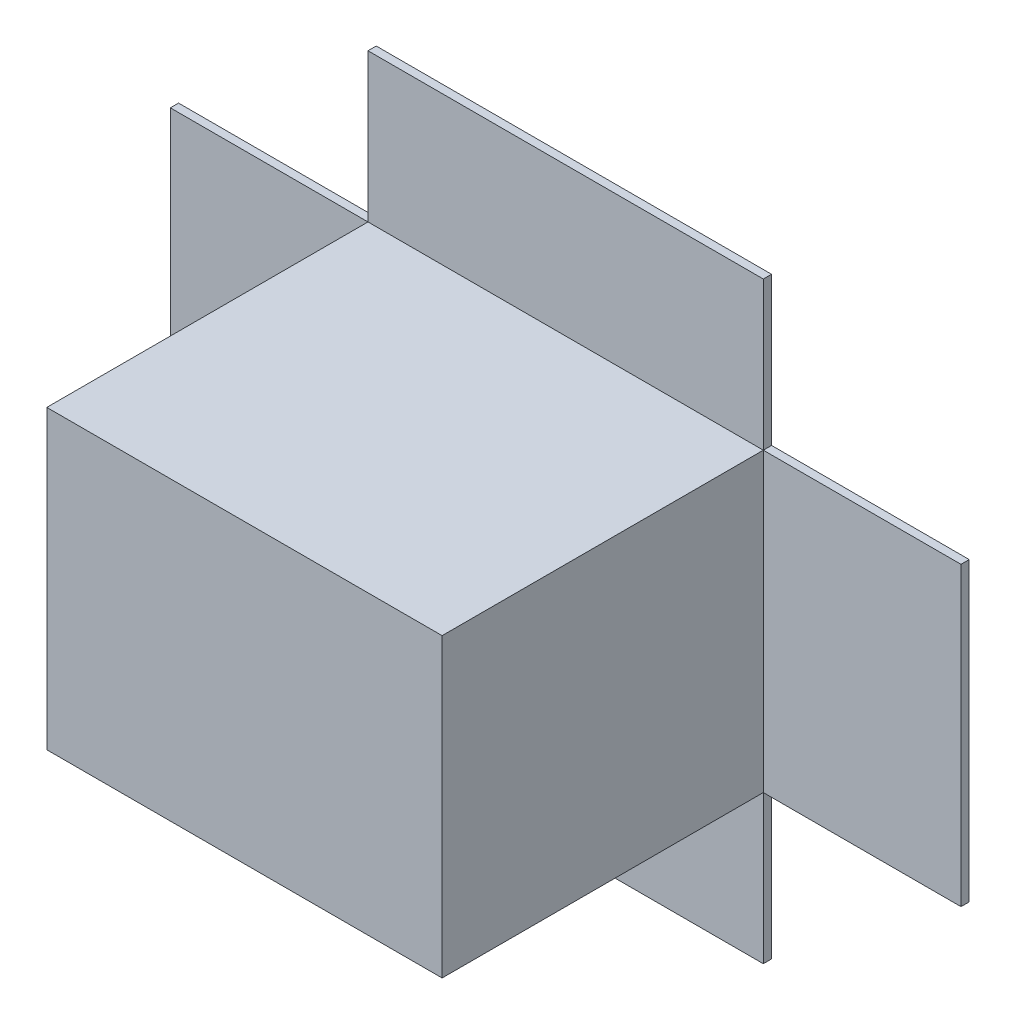
ISO-10303-21;
HEADER;
FILE_DESCRIPTION(('STEP AP214'),'2;1');
FILE_NAME('part.step','',(''),(''),'','','');
FILE_SCHEMA(('AUTOMOTIVE_DESIGN { 1 0 10303 214 1 1 1 1 }'));
ENDSEC;
DATA;
#1=APPLICATION_CONTEXT('core data for automotive mechanical design processes');
#2=APPLICATION_PROTOCOL_DEFINITION('international standard','automotive_design',2000,#1);
#3=PRODUCT_CONTEXT('',#1,'mechanical');
#4=PRODUCT('Part','Part','',(#3));
#5=PRODUCT_RELATED_PRODUCT_CATEGORY('part','',(#4));
#6=PRODUCT_DEFINITION_FORMATION('','',#4);
#7=PRODUCT_DEFINITION_CONTEXT('part definition',#1,'design');
#8=PRODUCT_DEFINITION('design','',#6,#7);
#9=PRODUCT_DEFINITION_SHAPE('','',#8);
#10=(LENGTH_UNIT() NAMED_UNIT(*) SI_UNIT(.MILLI.,.METRE.));
#11=(NAMED_UNIT(*) PLANE_ANGLE_UNIT() SI_UNIT($,.RADIAN.));
#12=(NAMED_UNIT(*) SI_UNIT($,.STERADIAN.) SOLID_ANGLE_UNIT());
#13=UNCERTAINTY_MEASURE_WITH_UNIT(LENGTH_MEASURE(1.E-05),#10,'distance_accuracy_value','');
#14=(GEOMETRIC_REPRESENTATION_CONTEXT(3) GLOBAL_UNCERTAINTY_ASSIGNED_CONTEXT((#13)) GLOBAL_UNIT_ASSIGNED_CONTEXT((#10,
#11,#12)) REPRESENTATION_CONTEXT('',''));
#15=CARTESIAN_POINT('',(0.,0.,0.));
#16=DIRECTION('',(0.,0.,1.));
#17=DIRECTION('',(1.,0.,0.));
#18=AXIS2_PLACEMENT_3D('',#15,#16,#17);
#19=CARTESIAN_POINT('',(0.,0.,0.));
#20=DIRECTION('',(0.,0.,-1.));
#21=DIRECTION('',(0.,-1.,0.));
#22=AXIS2_PLACEMENT_3D('',#19,#20,#21);
#23=PLANE('',#22);
#24=DIRECTION('',(-1.,0.,0.));
#25=VECTOR('',#24,1.);
#26=CARTESIAN_POINT('',(57.5,-44.5,0.));
#27=LINE('',#26,#25);
#28=CARTESIAN_POINT('',(-59.5,-44.5,0.));
#29=VERTEX_POINT('',#28);
#30=CARTESIAN_POINT('',(59.5,-44.5,0.));
#31=VERTEX_POINT('',#30);
#32=EDGE_CURVE('E403',#29,#31,#27,.F.);
#33=ORIENTED_EDGE('',*,*,#32,.T.);
#34=DIRECTION('',(0.,-1.,0.));
#35=VECTOR('',#34,1.);
#36=CARTESIAN_POINT('',(59.5,42.5,0.));
#37=LINE('',#36,#35);
#38=CARTESIAN_POINT('',(59.5,44.5,0.));
#39=VERTEX_POINT('',#38);
#40=EDGE_CURVE('E406',#31,#39,#37,.F.);
#41=ORIENTED_EDGE('',*,*,#40,.T.);
#42=DIRECTION('',(1.,0.,0.));
#43=VECTOR('',#42,1.);
#44=CARTESIAN_POINT('',(-57.5,44.5,0.));
#45=LINE('',#44,#43);
#46=CARTESIAN_POINT('',(-59.5,44.5,0.));
#47=VERTEX_POINT('',#46);
#48=EDGE_CURVE('E400',#39,#47,#45,.F.);
#49=ORIENTED_EDGE('',*,*,#48,.T.);
#50=DIRECTION('',(0.,1.,0.));
#51=VECTOR('',#50,1.);
#52=CARTESIAN_POINT('',(-59.5,-42.5,0.));
#53=LINE('',#52,#51);
#54=EDGE_CURVE('E397',#47,#29,#53,.F.);
#55=ORIENTED_EDGE('',*,*,#54,.T.);
#56=EDGE_LOOP('',(#33,#41,#49,#55));
#57=FACE_BOUND('',#56,.T.);
#58=DIRECTION('',(0.,1.,0.));
#59=VECTOR('',#58,1.);
#60=CARTESIAN_POINT('',(60.,45.,0.));
#61=LINE('',#60,#59);
#62=CARTESIAN_POINT('',(60.,45.,0.));
#63=VERTEX_POINT('',#62);
#64=CARTESIAN_POINT('',(60.,90.,0.));
#65=VERTEX_POINT('',#64);
#66=EDGE_CURVE('E297',#63,#65,#61,.T.);
#67=ORIENTED_EDGE('',*,*,#66,.F.);
#68=DIRECTION('',(1.,0.,0.));
#69=VECTOR('',#68,1.);
#70=CARTESIAN_POINT('',(60.,45.,0.));
#71=LINE('',#70,#69);
#72=CARTESIAN_POINT('',(120.,45.,0.));
#73=VERTEX_POINT('',#72);
#74=EDGE_CURVE('E362',#63,#73,#71,.T.);
#75=ORIENTED_EDGE('',*,*,#74,.T.);
#76=DIRECTION('',(0.,1.,0.));
#77=VECTOR('',#76,1.);
#78=CARTESIAN_POINT('',(120.,-45.,0.));
#79=LINE('',#78,#77);
#80=CARTESIAN_POINT('',(120.,-45.,0.));
#81=VERTEX_POINT('',#80);
#82=EDGE_CURVE('E268',#81,#73,#79,.T.);
#83=ORIENTED_EDGE('',*,*,#82,.F.);
#84=DIRECTION('',(1.,0.,0.));
#85=VECTOR('',#84,1.);
#86=CARTESIAN_POINT('',(60.,-45.,0.));
#87=LINE('',#86,#85);
#88=CARTESIAN_POINT('',(60.,-45.,0.));
#89=VERTEX_POINT('',#88);
#90=EDGE_CURVE('E274',#89,#81,#87,.T.);
#91=ORIENTED_EDGE('',*,*,#90,.F.);
#92=DIRECTION('',(0.,-1.,0.));
#93=VECTOR('',#92,1.);
#94=CARTESIAN_POINT('',(60.,-45.,0.));
#95=LINE('',#94,#93);
#96=CARTESIAN_POINT('',(60.,-90.,0.));
#97=VERTEX_POINT('',#96);
#98=EDGE_CURVE('E358',#89,#97,#95,.T.);
#99=ORIENTED_EDGE('',*,*,#98,.T.);
#100=DIRECTION('',(-1.,0.,0.));
#101=VECTOR('',#100,1.);
#102=CARTESIAN_POINT('',(60.,-90.,0.));
#103=LINE('',#102,#101);
#104=CARTESIAN_POINT('',(-60.,-90.,0.));
#105=VERTEX_POINT('',#104);
#106=EDGE_CURVE('E363',#97,#105,#103,.T.);
#107=ORIENTED_EDGE('',*,*,#106,.T.);
#108=DIRECTION('',(0.,-1.,0.));
#109=VECTOR('',#108,1.);
#110=CARTESIAN_POINT('',(-60.,-45.,0.));
#111=LINE('',#110,#109);
#112=CARTESIAN_POINT('',(-60.,-45.,0.));
#113=VERTEX_POINT('',#112);
#114=EDGE_CURVE('E273',#113,#105,#111,.T.);
#115=ORIENTED_EDGE('',*,*,#114,.F.);
#116=DIRECTION('',(-1.,0.,0.));
#117=VECTOR('',#116,1.);
#118=CARTESIAN_POINT('',(-60.,-45.,0.));
#119=LINE('',#118,#117);
#120=CARTESIAN_POINT('',(-120.,-45.,0.));
#121=VERTEX_POINT('',#120);
#122=EDGE_CURVE('E320',#113,#121,#119,.T.);
#123=ORIENTED_EDGE('',*,*,#122,.T.);
#124=DIRECTION('',(0.,-1.,0.));
#125=VECTOR('',#124,1.);
#126=CARTESIAN_POINT('',(-120.,45.,0.));
#127=LINE('',#126,#125);
#128=CARTESIAN_POINT('',(-120.,45.,0.));
#129=VERTEX_POINT('',#128);
#130=EDGE_CURVE('E302',#129,#121,#127,.T.);
#131=ORIENTED_EDGE('',*,*,#130,.F.);
#132=DIRECTION('',(-1.,0.,0.));
#133=VECTOR('',#132,1.);
#134=CARTESIAN_POINT('',(-60.,45.,0.));
#135=LINE('',#134,#133);
#136=CARTESIAN_POINT('',(-60.,45.,0.));
#137=VERTEX_POINT('',#136);
#138=EDGE_CURVE('E284',#137,#129,#135,.T.);
#139=ORIENTED_EDGE('',*,*,#138,.F.);
#140=DIRECTION('',(0.,1.,0.));
#141=VECTOR('',#140,1.);
#142=CARTESIAN_POINT('',(-60.,45.,0.));
#143=LINE('',#142,#141);
#144=CARTESIAN_POINT('',(-60.,90.,0.));
#145=VERTEX_POINT('',#144);
#146=EDGE_CURVE('E316',#137,#145,#143,.T.);
#147=ORIENTED_EDGE('',*,*,#146,.T.);
#148=DIRECTION('',(-1.,0.,0.));
#149=VECTOR('',#148,1.);
#150=CARTESIAN_POINT('',(60.,90.,0.));
#151=LINE('',#150,#149);
#152=EDGE_CURVE('E298',#65,#145,#151,.T.);
#153=ORIENTED_EDGE('',*,*,#152,.F.);
#154=EDGE_LOOP('',(#67,#75,#83,#91,#99,#107,#115,#123,#131,#139,#147,#153));
#155=FACE_BOUND('',#154,.T.);
#156=ADVANCED_FACE('F47',(#57,#155),#23,.T.);
#157=CARTESIAN_POINT('',(-57.5,42.5,97.5));
#158=DIRECTION('',(0.,1.,0.));
#159=DIRECTION('',(1.,0.,0.));
#160=AXIS2_PLACEMENT_3D('',#157,#158,#159);
#161=PLANE('',#160);
#162=DIRECTION('',(0.,0.,-1.));
#163=VECTOR('',#162,1.);
#164=CARTESIAN_POINT('',(-57.5,42.5,97.5));
#165=LINE('',#164,#163);
#166=CARTESIAN_POINT('',(-57.5,42.5,97.5));
#167=VERTEX_POINT('',#166);
#168=CARTESIAN_POINT('',(-57.5,42.5,2.));
#169=VERTEX_POINT('',#168);
#170=EDGE_CURVE('E321',#167,#169,#165,.T.);
#171=ORIENTED_EDGE('',*,*,#170,.T.);
#172=DIRECTION('',(1.,0.,0.));
#173=VECTOR('',#172,1.);
#174=CARTESIAN_POINT('',(57.5,42.5,2.));
#175=LINE('',#174,#173);
#176=CARTESIAN_POINT('',(57.5,42.5,2.));
#177=VERTEX_POINT('',#176);
#178=EDGE_CURVE('E57',#169,#177,#175,.T.);
#179=ORIENTED_EDGE('',*,*,#178,.T.);
#180=DIRECTION('',(0.,0.,-1.));
#181=VECTOR('',#180,1.);
#182=CARTESIAN_POINT('',(57.5,42.5,97.5));
#183=LINE('',#182,#181);
#184=CARTESIAN_POINT('',(57.5,42.5,97.5));
#185=VERTEX_POINT('',#184);
#186=EDGE_CURVE('E231',#185,#177,#183,.T.);
#187=ORIENTED_EDGE('',*,*,#186,.F.);
#188=DIRECTION('',(1.,0.,0.));
#189=VECTOR('',#188,1.);
#190=CARTESIAN_POINT('',(-57.5,42.5,97.5));
#191=LINE('',#190,#189);
#192=EDGE_CURVE('E222',#167,#185,#191,.T.);
#193=ORIENTED_EDGE('',*,*,#192,.F.);
#194=EDGE_LOOP('',(#171,#179,#187,#193));
#195=FACE_BOUND('',#194,.T.);
#196=ADVANCED_FACE('F234',(#195),#161,.F.);
#197=CARTESIAN_POINT('',(-57.5,-42.5,97.5));
#198=DIRECTION('',(-1.,0.,0.));
#199=DIRECTION('',(0.,0.,1.));
#200=AXIS2_PLACEMENT_3D('',#197,#198,#199);
#201=PLANE('',#200);
#202=DIRECTION('',(0.,0.,-1.));
#203=VECTOR('',#202,1.);
#204=CARTESIAN_POINT('',(-57.5,-42.5,97.5));
#205=LINE('',#204,#203);
#206=CARTESIAN_POINT('',(-57.5,-42.5,97.5));
#207=VERTEX_POINT('',#206);
#208=CARTESIAN_POINT('',(-57.5,-42.5,2.));
#209=VERTEX_POINT('',#208);
#210=EDGE_CURVE('E381',#207,#209,#205,.T.);
#211=ORIENTED_EDGE('',*,*,#210,.T.);
#212=DIRECTION('',(0.,1.,0.));
#213=VECTOR('',#212,1.);
#214=CARTESIAN_POINT('',(-57.5,42.5,2.));
#215=LINE('',#214,#213);
#216=EDGE_CURVE('E11',#209,#169,#215,.T.);
#217=ORIENTED_EDGE('',*,*,#216,.T.);
#218=ORIENTED_EDGE('',*,*,#170,.F.);
#219=DIRECTION('',(0.,1.,0.));
#220=VECTOR('',#219,1.);
#221=CARTESIAN_POINT('',(-57.5,-42.5,97.5));
#222=LINE('',#221,#220);
#223=EDGE_CURVE('E228',#207,#167,#222,.T.);
#224=ORIENTED_EDGE('',*,*,#223,.F.);
#225=EDGE_LOOP('',(#211,#217,#218,#224));
#226=FACE_BOUND('',#225,.T.);
#227=ADVANCED_FACE('F581',(#226),#201,.F.);
#228=CARTESIAN_POINT('',(57.5,-42.5,97.5));
#229=DIRECTION('',(0.,-1.,0.));
#230=DIRECTION('',(0.,0.,-1.));
#231=AXIS2_PLACEMENT_3D('',#228,#229,#230);
#232=PLANE('',#231);
#233=DIRECTION('',(0.,0.,-1.));
#234=VECTOR('',#233,1.);
#235=CARTESIAN_POINT('',(57.5,-42.5,97.5));
#236=LINE('',#235,#234);
#237=CARTESIAN_POINT('',(57.5,-42.5,97.5));
#238=VERTEX_POINT('',#237);
#239=CARTESIAN_POINT('',(57.5,-42.5,2.));
#240=VERTEX_POINT('',#239);
#241=EDGE_CURVE('E240',#238,#240,#236,.T.);
#242=ORIENTED_EDGE('',*,*,#241,.T.);
#243=DIRECTION('',(-1.,0.,0.));
#244=VECTOR('',#243,1.);
#245=CARTESIAN_POINT('',(-57.5,-42.5,2.));
#246=LINE('',#245,#244);
#247=EDGE_CURVE('E71',#240,#209,#246,.T.);
#248=ORIENTED_EDGE('',*,*,#247,.T.);
#249=ORIENTED_EDGE('',*,*,#210,.F.);
#250=DIRECTION('',(-1.,0.,0.));
#251=VECTOR('',#250,1.);
#252=CARTESIAN_POINT('',(57.5,-42.5,97.5));
#253=LINE('',#252,#251);
#254=EDGE_CURVE('E245',#238,#207,#253,.T.);
#255=ORIENTED_EDGE('',*,*,#254,.F.);
#256=EDGE_LOOP('',(#242,#248,#249,#255));
#257=FACE_BOUND('',#256,.T.);
#258=ADVANCED_FACE('F441',(#257),#232,.F.);
#259=CARTESIAN_POINT('',(57.5,42.5,97.5));
#260=DIRECTION('',(1.,0.,0.));
#261=DIRECTION('',(0.,1.,0.));
#262=AXIS2_PLACEMENT_3D('',#259,#260,#261);
#263=PLANE('',#262);
#264=ORIENTED_EDGE('',*,*,#186,.T.);
#265=DIRECTION('',(0.,-1.,0.));
#266=VECTOR('',#265,1.);
#267=CARTESIAN_POINT('',(57.5,-42.5,2.));
#268=LINE('',#267,#266);
#269=EDGE_CURVE('E394',#177,#240,#268,.T.);
#270=ORIENTED_EDGE('',*,*,#269,.T.);
#271=ORIENTED_EDGE('',*,*,#241,.F.);
#272=DIRECTION('',(0.,-1.,0.));
#273=VECTOR('',#272,1.);
#274=CARTESIAN_POINT('',(57.5,42.5,97.5));
#275=LINE('',#274,#273);
#276=EDGE_CURVE('E227',#185,#238,#275,.T.);
#277=ORIENTED_EDGE('',*,*,#276,.F.);
#278=EDGE_LOOP('',(#264,#270,#271,#277));
#279=FACE_BOUND('',#278,.T.);
#280=ADVANCED_FACE('F243',(#279),#263,.F.);
#281=CARTESIAN_POINT('',(0.,0.,97.5));
#282=DIRECTION('',(0.,0.,-1.));
#283=DIRECTION('',(0.,-1.,0.));
#284=AXIS2_PLACEMENT_3D('',#281,#282,#283);
#285=PLANE('',#284);
#286=ORIENTED_EDGE('',*,*,#192,.T.);
#287=ORIENTED_EDGE('',*,*,#276,.T.);
#288=ORIENTED_EDGE('',*,*,#254,.T.);
#289=ORIENTED_EDGE('',*,*,#223,.T.);
#290=EDGE_LOOP('',(#286,#287,#288,#289));
#291=FACE_BOUND('',#290,.T.);
#292=ADVANCED_FACE('F224',(#291),#285,.T.);
#293=CARTESIAN_POINT('',(0.,0.,2.5));
#294=DIRECTION('',(0.,0.,-1.));
#295=DIRECTION('',(0.,-1.,0.));
#296=AXIS2_PLACEMENT_3D('',#293,#294,#295);
#297=PLANE('',#296);
#298=DIRECTION('',(1.,0.,0.));
#299=VECTOR('',#298,1.);
#300=CARTESIAN_POINT('',(60.,45.,2.5));
#301=LINE('',#300,#299);
#302=CARTESIAN_POINT('',(60.,45.,2.5));
#303=VERTEX_POINT('',#302);
#304=CARTESIAN_POINT('',(120.,45.,2.5));
#305=VERTEX_POINT('',#304);
#306=EDGE_CURVE('E459',#303,#305,#301,.T.);
#307=ORIENTED_EDGE('',*,*,#306,.F.);
#308=DIRECTION('',(0.,-1.,0.));
#309=VECTOR('',#308,1.);
#310=CARTESIAN_POINT('',(60.,45.,2.5));
#311=LINE('',#310,#309);
#312=CARTESIAN_POINT('',(60.,-45.,2.5));
#313=VERTEX_POINT('',#312);
#314=EDGE_CURVE('E326',#303,#313,#311,.T.);
#315=ORIENTED_EDGE('',*,*,#314,.T.);
#316=DIRECTION('',(1.,0.,0.));
#317=VECTOR('',#316,1.);
#318=CARTESIAN_POINT('',(60.,-45.,2.5));
#319=LINE('',#318,#317);
#320=CARTESIAN_POINT('',(120.,-45.,2.5));
#321=VERTEX_POINT('',#320);
#322=EDGE_CURVE('E330',#313,#321,#319,.T.);
#323=ORIENTED_EDGE('',*,*,#322,.T.);
#324=DIRECTION('',(0.,1.,0.));
#325=VECTOR('',#324,1.);
#326=CARTESIAN_POINT('',(120.,-45.,2.5));
#327=LINE('',#326,#325);
#328=EDGE_CURVE('E340',#321,#305,#327,.T.);
#329=ORIENTED_EDGE('',*,*,#328,.T.);
#330=EDGE_LOOP('',(#307,#315,#323,#329));
#331=FACE_BOUND('',#330,.T.);
#332=ADVANCED_FACE('F516',(#331),#297,.F.);
#333=CARTESIAN_POINT('',(0.,0.,2.5));
#334=DIRECTION('',(0.,0.,-1.));
#335=DIRECTION('',(0.,-1.,0.));
#336=AXIS2_PLACEMENT_3D('',#333,#334,#335);
#337=PLANE('',#336);
#338=DIRECTION('',(0.,1.,0.));
#339=VECTOR('',#338,1.);
#340=CARTESIAN_POINT('',(-60.,45.,2.5));
#341=LINE('',#340,#339);
#342=CARTESIAN_POINT('',(-60.,45.,2.5));
#343=VERTEX_POINT('',#342);
#344=CARTESIAN_POINT('',(-60.,90.,2.5));
#345=VERTEX_POINT('',#344);
#346=EDGE_CURVE('E393',#343,#345,#341,.T.);
#347=ORIENTED_EDGE('',*,*,#346,.F.);
#348=DIRECTION('',(1.,0.,0.));
#349=VECTOR('',#348,1.);
#350=CARTESIAN_POINT('',(-60.,45.,2.5));
#351=LINE('',#350,#349);
#352=EDGE_CURVE('E367',#343,#303,#351,.T.);
#353=ORIENTED_EDGE('',*,*,#352,.T.);
#354=DIRECTION('',(0.,1.,0.));
#355=VECTOR('',#354,1.);
#356=CARTESIAN_POINT('',(60.,45.,2.5));
#357=LINE('',#356,#355);
#358=CARTESIAN_POINT('',(60.,90.,2.5));
#359=VERTEX_POINT('',#358);
#360=EDGE_CURVE('E348',#303,#359,#357,.T.);
#361=ORIENTED_EDGE('',*,*,#360,.T.);
#362=DIRECTION('',(-1.,0.,0.));
#363=VECTOR('',#362,1.);
#364=CARTESIAN_POINT('',(60.,90.,2.5));
#365=LINE('',#364,#363);
#366=EDGE_CURVE('E344',#359,#345,#365,.T.);
#367=ORIENTED_EDGE('',*,*,#366,.T.);
#368=EDGE_LOOP('',(#347,#353,#361,#367));
#369=FACE_BOUND('',#368,.T.);
#370=ADVANCED_FACE('F544',(#369),#337,.F.);
#371=CARTESIAN_POINT('',(0.,0.,2.5));
#372=DIRECTION('',(0.,0.,-1.));
#373=DIRECTION('',(0.,-1.,0.));
#374=AXIS2_PLACEMENT_3D('',#371,#372,#373);
#375=PLANE('',#374);
#376=DIRECTION('',(-1.,0.,0.));
#377=VECTOR('',#376,1.);
#378=CARTESIAN_POINT('',(-60.,-45.,2.5));
#379=LINE('',#378,#377);
#380=CARTESIAN_POINT('',(-60.,-45.,2.5));
#381=VERTEX_POINT('',#380);
#382=CARTESIAN_POINT('',(-120.,-45.,2.5));
#383=VERTEX_POINT('',#382);
#384=EDGE_CURVE('E307',#381,#383,#379,.T.);
#385=ORIENTED_EDGE('',*,*,#384,.F.);
#386=DIRECTION('',(0.,1.,0.));
#387=VECTOR('',#386,1.);
#388=CARTESIAN_POINT('',(-60.,-45.,2.5));
#389=LINE('',#388,#387);
#390=EDGE_CURVE('E335',#381,#343,#389,.T.);
#391=ORIENTED_EDGE('',*,*,#390,.T.);
#392=DIRECTION('',(-1.,0.,0.));
#393=VECTOR('',#392,1.);
#394=CARTESIAN_POINT('',(-60.,45.,2.5));
#395=LINE('',#394,#393);
#396=CARTESIAN_POINT('',(-120.,45.,2.5));
#397=VERTEX_POINT('',#396);
#398=EDGE_CURVE('E331',#343,#397,#395,.T.);
#399=ORIENTED_EDGE('',*,*,#398,.T.);
#400=DIRECTION('',(0.,-1.,0.));
#401=VECTOR('',#400,1.);
#402=CARTESIAN_POINT('',(-120.,45.,2.5));
#403=LINE('',#402,#401);
#404=EDGE_CURVE('E336',#397,#383,#403,.T.);
#405=ORIENTED_EDGE('',*,*,#404,.T.);
#406=EDGE_LOOP('',(#385,#391,#399,#405));
#407=FACE_BOUND('',#406,.T.);
#408=ADVANCED_FACE('F537',(#407),#375,.F.);
#409=CARTESIAN_POINT('',(0.,0.,2.5));
#410=DIRECTION('',(0.,0.,-1.));
#411=DIRECTION('',(0.,-1.,0.));
#412=AXIS2_PLACEMENT_3D('',#409,#410,#411);
#413=PLANE('',#412);
#414=DIRECTION('',(0.,-1.,0.));
#415=VECTOR('',#414,1.);
#416=CARTESIAN_POINT('',(60.,-45.,2.5));
#417=LINE('',#416,#415);
#418=CARTESIAN_POINT('',(60.,-90.,2.5));
#419=VERTEX_POINT('',#418);
#420=EDGE_CURVE('E460',#313,#419,#417,.T.);
#421=ORIENTED_EDGE('',*,*,#420,.F.);
#422=DIRECTION('',(-1.,0.,0.));
#423=VECTOR('',#422,1.);
#424=CARTESIAN_POINT('',(60.,-45.,2.5));
#425=LINE('',#424,#423);
#426=EDGE_CURVE('E267',#313,#381,#425,.T.);
#427=ORIENTED_EDGE('',*,*,#426,.T.);
#428=DIRECTION('',(0.,-1.,0.));
#429=VECTOR('',#428,1.);
#430=CARTESIAN_POINT('',(-60.,-45.,2.5));
#431=LINE('',#430,#429);
#432=CARTESIAN_POINT('',(-60.,-90.,2.5));
#433=VERTEX_POINT('',#432);
#434=EDGE_CURVE('E264',#381,#433,#431,.T.);
#435=ORIENTED_EDGE('',*,*,#434,.T.);
#436=DIRECTION('',(-1.,0.,0.));
#437=VECTOR('',#436,1.);
#438=CARTESIAN_POINT('',(60.,-90.,2.5));
#439=LINE('',#438,#437);
#440=EDGE_CURVE('E253',#419,#433,#439,.T.);
#441=ORIENTED_EDGE('',*,*,#440,.F.);
#442=EDGE_LOOP('',(#421,#427,#435,#441));
#443=FACE_BOUND('',#442,.T.);
#444=ADVANCED_FACE('F530',(#443),#413,.F.);
#445=CARTESIAN_POINT('',(120.,0.,2.5));
#446=DIRECTION('',(-1.,0.,0.));
#447=DIRECTION('',(0.,0.,1.));
#448=AXIS2_PLACEMENT_3D('',#445,#446,#447);
#449=PLANE('',#448);
#450=ORIENTED_EDGE('',*,*,#82,.T.);
#451=DIRECTION('',(0.,0.,-1.));
#452=VECTOR('',#451,1.);
#453=CARTESIAN_POINT('',(120.,45.,2.5));
#454=LINE('',#453,#452);
#455=EDGE_CURVE('E315',#305,#73,#454,.T.);
#456=ORIENTED_EDGE('',*,*,#455,.F.);
#457=ORIENTED_EDGE('',*,*,#328,.F.);
#458=DIRECTION('',(0.,0.,-1.));
#459=VECTOR('',#458,1.);
#460=CARTESIAN_POINT('',(120.,-45.,2.5));
#461=LINE('',#460,#459);
#462=EDGE_CURVE('E351',#321,#81,#461,.T.);
#463=ORIENTED_EDGE('',*,*,#462,.T.);
#464=EDGE_LOOP('',(#450,#456,#457,#463));
#465=FACE_BOUND('',#464,.T.);
#466=ADVANCED_FACE('F504',(#465),#449,.F.);
#467=CARTESIAN_POINT('',(0.,45.,2.5));
#468=DIRECTION('',(0.,1.,0.));
#469=DIRECTION('',(1.,0.,0.));
#470=AXIS2_PLACEMENT_3D('',#467,#468,#469);
#471=PLANE('',#470);
#472=ORIENTED_EDGE('',*,*,#74,.F.);
#473=DIRECTION('',(0.,0.,-1.));
#474=VECTOR('',#473,1.);
#475=CARTESIAN_POINT('',(60.,45.,2.5));
#476=LINE('',#475,#474);
#477=EDGE_CURVE('E293',#303,#63,#476,.T.);
#478=ORIENTED_EDGE('',*,*,#477,.F.);
#479=ORIENTED_EDGE('',*,*,#306,.T.);
#480=ORIENTED_EDGE('',*,*,#455,.T.);
#481=EDGE_LOOP('',(#472,#478,#479,#480));
#482=FACE_BOUND('',#481,.T.);
#483=ADVANCED_FACE('F512',(#482),#471,.T.);
#484=CARTESIAN_POINT('',(60.,0.,2.5));
#485=DIRECTION('',(-1.,0.,0.));
#486=DIRECTION('',(0.,0.,1.));
#487=AXIS2_PLACEMENT_3D('',#484,#485,#486);
#488=PLANE('',#487);
#489=ORIENTED_EDGE('',*,*,#66,.T.);
#490=DIRECTION('',(0.,0.,-1.));
#491=VECTOR('',#490,1.);
#492=CARTESIAN_POINT('',(60.,90.,2.5));
#493=LINE('',#492,#491);
#494=EDGE_CURVE('E343',#359,#65,#493,.T.);
#495=ORIENTED_EDGE('',*,*,#494,.F.);
#496=ORIENTED_EDGE('',*,*,#360,.F.);
#497=ORIENTED_EDGE('',*,*,#477,.T.);
#498=EDGE_LOOP('',(#489,#495,#496,#497));
#499=FACE_BOUND('',#498,.T.);
#500=ADVANCED_FACE('F561',(#499),#488,.F.);
#501=CARTESIAN_POINT('',(0.,90.,2.5));
#502=DIRECTION('',(0.,-1.,0.));
#503=DIRECTION('',(0.,0.,-1.));
#504=AXIS2_PLACEMENT_3D('',#501,#502,#503);
#505=PLANE('',#504);
#506=ORIENTED_EDGE('',*,*,#152,.T.);
#507=DIRECTION('',(0.,0.,-1.));
#508=VECTOR('',#507,1.);
#509=CARTESIAN_POINT('',(-60.,90.,2.5));
#510=LINE('',#509,#508);
#511=EDGE_CURVE('E288',#345,#145,#510,.T.);
#512=ORIENTED_EDGE('',*,*,#511,.F.);
#513=ORIENTED_EDGE('',*,*,#366,.F.);
#514=ORIENTED_EDGE('',*,*,#494,.T.);
#515=EDGE_LOOP('',(#506,#512,#513,#514));
#516=FACE_BOUND('',#515,.T.);
#517=ADVANCED_FACE('F559',(#516),#505,.F.);
#518=CARTESIAN_POINT('',(-60.,0.,2.5));
#519=DIRECTION('',(-1.,0.,0.));
#520=DIRECTION('',(0.,0.,1.));
#521=AXIS2_PLACEMENT_3D('',#518,#519,#520);
#522=PLANE('',#521);
#523=ORIENTED_EDGE('',*,*,#146,.F.);
#524=DIRECTION('',(0.,0.,-1.));
#525=VECTOR('',#524,1.);
#526=CARTESIAN_POINT('',(-60.,45.,2.5));
#527=LINE('',#526,#525);
#528=EDGE_CURVE('E289',#343,#137,#527,.T.);
#529=ORIENTED_EDGE('',*,*,#528,.F.);
#530=ORIENTED_EDGE('',*,*,#346,.T.);
#531=ORIENTED_EDGE('',*,*,#511,.T.);
#532=EDGE_LOOP('',(#523,#529,#530,#531));
#533=FACE_BOUND('',#532,.T.);
#534=ADVANCED_FACE('F557',(#533),#522,.T.);
#535=CARTESIAN_POINT('',(0.,45.,2.5));
#536=DIRECTION('',(0.,-1.,0.));
#537=DIRECTION('',(0.,0.,-1.));
#538=AXIS2_PLACEMENT_3D('',#535,#536,#537);
#539=PLANE('',#538);
#540=ORIENTED_EDGE('',*,*,#138,.T.);
#541=DIRECTION('',(0.,0.,-1.));
#542=VECTOR('',#541,1.);
#543=CARTESIAN_POINT('',(-120.,45.,2.5));
#544=LINE('',#543,#542);
#545=EDGE_CURVE('E310',#397,#129,#544,.T.);
#546=ORIENTED_EDGE('',*,*,#545,.F.);
#547=ORIENTED_EDGE('',*,*,#398,.F.);
#548=ORIENTED_EDGE('',*,*,#528,.T.);
#549=EDGE_LOOP('',(#540,#546,#547,#548));
#550=FACE_BOUND('',#549,.T.);
#551=ADVANCED_FACE('F550',(#550),#539,.F.);
#552=CARTESIAN_POINT('',(-120.,0.,2.5));
#553=DIRECTION('',(1.,0.,0.));
#554=DIRECTION('',(0.,1.,0.));
#555=AXIS2_PLACEMENT_3D('',#552,#553,#554);
#556=PLANE('',#555);
#557=ORIENTED_EDGE('',*,*,#130,.T.);
#558=DIRECTION('',(0.,0.,-1.));
#559=VECTOR('',#558,1.);
#560=CARTESIAN_POINT('',(-120.,-45.,2.5));
#561=LINE('',#560,#559);
#562=EDGE_CURVE('E311',#383,#121,#561,.T.);
#563=ORIENTED_EDGE('',*,*,#562,.F.);
#564=ORIENTED_EDGE('',*,*,#404,.F.);
#565=ORIENTED_EDGE('',*,*,#545,.T.);
#566=EDGE_LOOP('',(#557,#563,#564,#565));
#567=FACE_BOUND('',#566,.T.);
#568=ADVANCED_FACE('F552',(#567),#556,.F.);
#569=CARTESIAN_POINT('',(0.,-45.,2.5));
#570=DIRECTION('',(0.,-1.,0.));
#571=DIRECTION('',(0.,0.,-1.));
#572=AXIS2_PLACEMENT_3D('',#569,#570,#571);
#573=PLANE('',#572);
#574=ORIENTED_EDGE('',*,*,#122,.F.);
#575=DIRECTION('',(0.,0.,-1.));
#576=VECTOR('',#575,1.);
#577=CARTESIAN_POINT('',(-60.,-45.,2.5));
#578=LINE('',#577,#576);
#579=EDGE_CURVE('E256',#381,#113,#578,.T.);
#580=ORIENTED_EDGE('',*,*,#579,.F.);
#581=ORIENTED_EDGE('',*,*,#384,.T.);
#582=ORIENTED_EDGE('',*,*,#562,.T.);
#583=EDGE_LOOP('',(#574,#580,#581,#582));
#584=FACE_BOUND('',#583,.T.);
#585=ADVANCED_FACE('F555',(#584),#573,.T.);
#586=CARTESIAN_POINT('',(-60.,0.,2.5));
#587=DIRECTION('',(1.,0.,0.));
#588=DIRECTION('',(0.,0.,1.));
#589=AXIS2_PLACEMENT_3D('',#586,#587,#588);
#590=PLANE('',#589);
#591=ORIENTED_EDGE('',*,*,#114,.T.);
#592=DIRECTION('',(0.,0.,-1.));
#593=VECTOR('',#592,1.);
#594=CARTESIAN_POINT('',(-60.,-90.,2.5));
#595=LINE('',#594,#593);
#596=EDGE_CURVE('E257',#433,#105,#595,.T.);
#597=ORIENTED_EDGE('',*,*,#596,.F.);
#598=ORIENTED_EDGE('',*,*,#434,.F.);
#599=ORIENTED_EDGE('',*,*,#579,.T.);
#600=EDGE_LOOP('',(#591,#597,#598,#599));
#601=FACE_BOUND('',#600,.T.);
#602=ADVANCED_FACE('F482',(#601),#590,.F.);
#603=CARTESIAN_POINT('',(0.,-90.,2.5));
#604=DIRECTION('',(0.,-1.,0.));
#605=DIRECTION('',(0.,0.,-1.));
#606=AXIS2_PLACEMENT_3D('',#603,#604,#605);
#607=PLANE('',#606);
#608=ORIENTED_EDGE('',*,*,#106,.F.);
#609=DIRECTION('',(0.,0.,-1.));
#610=VECTOR('',#609,1.);
#611=CARTESIAN_POINT('',(60.,-90.,2.5));
#612=LINE('',#611,#610);
#613=EDGE_CURVE('E277',#419,#97,#612,.T.);
#614=ORIENTED_EDGE('',*,*,#613,.F.);
#615=ORIENTED_EDGE('',*,*,#440,.T.);
#616=ORIENTED_EDGE('',*,*,#596,.T.);
#617=EDGE_LOOP('',(#608,#614,#615,#616));
#618=FACE_BOUND('',#617,.T.);
#619=ADVANCED_FACE('F476',(#618),#607,.T.);
#620=CARTESIAN_POINT('',(60.,0.,2.5));
#621=DIRECTION('',(1.,0.,0.));
#622=DIRECTION('',(0.,1.,0.));
#623=AXIS2_PLACEMENT_3D('',#620,#621,#622);
#624=PLANE('',#623);
#625=ORIENTED_EDGE('',*,*,#98,.F.);
#626=DIRECTION('',(0.,0.,-1.));
#627=VECTOR('',#626,1.);
#628=CARTESIAN_POINT('',(60.,-45.,2.5));
#629=LINE('',#628,#627);
#630=EDGE_CURVE('E278',#313,#89,#629,.T.);
#631=ORIENTED_EDGE('',*,*,#630,.F.);
#632=ORIENTED_EDGE('',*,*,#420,.T.);
#633=ORIENTED_EDGE('',*,*,#613,.T.);
#634=EDGE_LOOP('',(#625,#631,#632,#633));
#635=FACE_BOUND('',#634,.T.);
#636=ADVANCED_FACE('F614',(#635),#624,.T.);
#637=CARTESIAN_POINT('',(0.,-45.,2.5));
#638=DIRECTION('',(0.,1.,0.));
#639=DIRECTION('',(1.,0.,0.));
#640=AXIS2_PLACEMENT_3D('',#637,#638,#639);
#641=PLANE('',#640);
#642=ORIENTED_EDGE('',*,*,#90,.T.);
#643=ORIENTED_EDGE('',*,*,#462,.F.);
#644=ORIENTED_EDGE('',*,*,#322,.F.);
#645=ORIENTED_EDGE('',*,*,#630,.T.);
#646=EDGE_LOOP('',(#642,#643,#644,#645));
#647=FACE_BOUND('',#646,.T.);
#648=ADVANCED_FACE('F509',(#647),#641,.F.);
#649=CARTESIAN_POINT('',(0.,0.,100.));
#650=DIRECTION('',(0.,0.,-1.));
#651=DIRECTION('',(0.,-1.,0.));
#652=AXIS2_PLACEMENT_3D('',#649,#650,#651);
#653=PLANE('',#652);
#654=DIRECTION('',(0.,1.,0.));
#655=VECTOR('',#654,1.);
#656=CARTESIAN_POINT('',(60.,-45.,100.));
#657=LINE('',#656,#655);
#658=CARTESIAN_POINT('',(60.,-45.,100.));
#659=VERTEX_POINT('',#658);
#660=CARTESIAN_POINT('',(60.,45.,100.));
#661=VERTEX_POINT('',#660);
#662=EDGE_CURVE('E306',#659,#661,#657,.T.);
#663=ORIENTED_EDGE('',*,*,#662,.T.);
#664=DIRECTION('',(-1.,0.,0.));
#665=VECTOR('',#664,1.);
#666=CARTESIAN_POINT('',(60.,45.,100.));
#667=LINE('',#666,#665);
#668=CARTESIAN_POINT('',(-60.,45.,100.));
#669=VERTEX_POINT('',#668);
#670=EDGE_CURVE('E262',#661,#669,#667,.T.);
#671=ORIENTED_EDGE('',*,*,#670,.T.);
#672=DIRECTION('',(0.,-1.,0.));
#673=VECTOR('',#672,1.);
#674=CARTESIAN_POINT('',(-60.,45.,100.));
#675=LINE('',#674,#673);
#676=CARTESIAN_POINT('',(-60.,-45.,100.));
#677=VERTEX_POINT('',#676);
#678=EDGE_CURVE('E258',#669,#677,#675,.T.);
#679=ORIENTED_EDGE('',*,*,#678,.T.);
#680=DIRECTION('',(1.,0.,0.));
#681=VECTOR('',#680,1.);
#682=CARTESIAN_POINT('',(-60.,-45.,100.));
#683=LINE('',#682,#681);
#684=EDGE_CURVE('E263',#677,#659,#683,.T.);
#685=ORIENTED_EDGE('',*,*,#684,.T.);
#686=EDGE_LOOP('',(#663,#671,#679,#685));
#687=FACE_BOUND('',#686,.T.);
#688=ADVANCED_FACE('F608',(#687),#653,.F.);
#689=CARTESIAN_POINT('',(-60.,-45.,100.));
#690=DIRECTION('',(0.,1.,0.));
#691=DIRECTION('',(1.,0.,0.));
#692=AXIS2_PLACEMENT_3D('',#689,#690,#691);
#693=PLANE('',#692);
#694=ORIENTED_EDGE('',*,*,#426,.F.);
#695=DIRECTION('',(0.,0.,-1.));
#696=VECTOR('',#695,1.);
#697=CARTESIAN_POINT('',(60.,-45.,100.));
#698=LINE('',#697,#696);
#699=EDGE_CURVE('E279',#659,#313,#698,.T.);
#700=ORIENTED_EDGE('',*,*,#699,.F.);
#701=ORIENTED_EDGE('',*,*,#684,.F.);
#702=DIRECTION('',(0.,0.,-1.));
#703=VECTOR('',#702,1.);
#704=CARTESIAN_POINT('',(-60.,-45.,100.));
#705=LINE('',#704,#703);
#706=EDGE_CURVE('E292',#677,#381,#705,.T.);
#707=ORIENTED_EDGE('',*,*,#706,.T.);
#708=EDGE_LOOP('',(#694,#700,#701,#707));
#709=FACE_BOUND('',#708,.T.);
#710=ADVANCED_FACE('F525',(#709),#693,.F.);
#711=CARTESIAN_POINT('',(-60.,-45.,100.));
#712=DIRECTION('',(1.,0.,0.));
#713=DIRECTION('',(0.,1.,0.));
#714=AXIS2_PLACEMENT_3D('',#711,#712,#713);
#715=PLANE('',#714);
#716=ORIENTED_EDGE('',*,*,#390,.F.);
#717=ORIENTED_EDGE('',*,*,#706,.F.);
#718=ORIENTED_EDGE('',*,*,#678,.F.);
#719=DIRECTION('',(0.,0.,-1.));
#720=VECTOR('',#719,1.);
#721=CARTESIAN_POINT('',(-60.,45.,100.));
#722=LINE('',#721,#720);
#723=EDGE_CURVE('E322',#669,#343,#722,.T.);
#724=ORIENTED_EDGE('',*,*,#723,.T.);
#725=EDGE_LOOP('',(#716,#717,#718,#724));
#726=FACE_BOUND('',#725,.T.);
#727=ADVANCED_FACE('F532',(#726),#715,.F.);
#728=CARTESIAN_POINT('',(-60.,45.,100.));
#729=DIRECTION('',(0.,-1.,0.));
#730=DIRECTION('',(0.,0.,-1.));
#731=AXIS2_PLACEMENT_3D('',#728,#729,#730);
#732=PLANE('',#731);
#733=ORIENTED_EDGE('',*,*,#352,.F.);
#734=ORIENTED_EDGE('',*,*,#723,.F.);
#735=ORIENTED_EDGE('',*,*,#670,.F.);
#736=DIRECTION('',(0.,0.,-1.));
#737=VECTOR('',#736,1.);
#738=CARTESIAN_POINT('',(60.,45.,100.));
#739=LINE('',#738,#737);
#740=EDGE_CURVE('E282',#661,#303,#739,.T.);
#741=ORIENTED_EDGE('',*,*,#740,.T.);
#742=EDGE_LOOP('',(#733,#734,#735,#741));
#743=FACE_BOUND('',#742,.T.);
#744=ADVANCED_FACE('F541',(#743),#732,.F.);
#745=CARTESIAN_POINT('',(60.,-45.,100.));
#746=DIRECTION('',(-1.,0.,0.));
#747=DIRECTION('',(0.,0.,1.));
#748=AXIS2_PLACEMENT_3D('',#745,#746,#747);
#749=PLANE('',#748);
#750=ORIENTED_EDGE('',*,*,#314,.F.);
#751=ORIENTED_EDGE('',*,*,#740,.F.);
#752=ORIENTED_EDGE('',*,*,#662,.F.);
#753=ORIENTED_EDGE('',*,*,#699,.T.);
#754=EDGE_LOOP('',(#750,#751,#752,#753));
#755=FACE_BOUND('',#754,.T.);
#756=ADVANCED_FACE('F522',(#755),#749,.F.);
#757=CARTESIAN_POINT('',(-59.5,-42.5,2.));
#758=DIRECTION('',(0.,-1.,0.));
#759=DIRECTION('',(0.,0.,-1.));
#760=AXIS2_PLACEMENT_3D('',#757,#758,#759);
#761=CYLINDRICAL_SURFACE('',#760,2.);
#762=CARTESIAN_POINT('',(-59.5,-44.5,2.));
#763=DIRECTION('',(0.707106781186547,-0.707106781186547,0.));
#764=DIRECTION('',(0.707106781186547,0.707106781186547,0.));
#765=AXIS2_PLACEMENT_3D('',#762,#763,#764);
#766=ELLIPSE('',#765,2.82842712474619,2.);
#767=EDGE_CURVE('E419',#29,#209,#766,.T.);
#768=ORIENTED_EDGE('',*,*,#767,.F.);
#769=ORIENTED_EDGE('',*,*,#54,.F.);
#770=CARTESIAN_POINT('',(-59.5,44.5,2.));
#771=DIRECTION('',(-0.707106781186547,-0.707106781186547,0.));
#772=DIRECTION('',(-0.707106781186547,0.707106781186547,0.));
#773=AXIS2_PLACEMENT_3D('',#770,#771,#772);
#774=ELLIPSE('',#773,2.82842712474619,2.);
#775=EDGE_CURVE('E51',#169,#47,#774,.F.);
#776=ORIENTED_EDGE('',*,*,#775,.F.);
#777=ORIENTED_EDGE('',*,*,#216,.F.);
#778=EDGE_LOOP('',(#768,#769,#776,#777));
#779=FACE_BOUND('',#778,.T.);
#780=ADVANCED_FACE('F49',(#779),#761,.T.);
#781=CARTESIAN_POINT('',(-57.5,44.5,2.));
#782=DIRECTION('',(-1.,0.,0.));
#783=DIRECTION('',(0.,0.,1.));
#784=AXIS2_PLACEMENT_3D('',#781,#782,#783);
#785=CYLINDRICAL_SURFACE('',#784,2.);
#786=ORIENTED_EDGE('',*,*,#775,.T.);
#787=ORIENTED_EDGE('',*,*,#48,.F.);
#788=CARTESIAN_POINT('',(59.5,44.5,2.));
#789=DIRECTION('',(-0.707106781186547,0.707106781186547,0.));
#790=DIRECTION('',(0.707106781186547,0.707106781186547,0.));
#791=AXIS2_PLACEMENT_3D('',#788,#789,#790);
#792=ELLIPSE('',#791,2.82842712474619,2.);
#793=EDGE_CURVE('E417',#177,#39,#792,.F.);
#794=ORIENTED_EDGE('',*,*,#793,.F.);
#795=ORIENTED_EDGE('',*,*,#178,.F.);
#796=EDGE_LOOP('',(#786,#787,#794,#795));
#797=FACE_BOUND('',#796,.T.);
#798=ADVANCED_FACE('F430',(#797),#785,.T.);
#799=CARTESIAN_POINT('',(57.5,-44.5,2.));
#800=DIRECTION('',(1.,0.,0.));
#801=DIRECTION('',(0.,0.,-1.));
#802=AXIS2_PLACEMENT_3D('',#799,#800,#801);
#803=CYLINDRICAL_SURFACE('',#802,2.);
#804=ORIENTED_EDGE('',*,*,#767,.T.);
#805=ORIENTED_EDGE('',*,*,#247,.F.);
#806=CARTESIAN_POINT('',(59.5,-44.5,2.));
#807=DIRECTION('',(0.707106781186547,0.707106781186547,0.));
#808=DIRECTION('',(-0.707106781186547,0.707106781186547,0.));
#809=AXIS2_PLACEMENT_3D('',#806,#807,#808);
#810=ELLIPSE('',#809,2.82842712474619,2.);
#811=EDGE_CURVE('E414',#31,#240,#810,.T.);
#812=ORIENTED_EDGE('',*,*,#811,.F.);
#813=ORIENTED_EDGE('',*,*,#32,.F.);
#814=EDGE_LOOP('',(#804,#805,#812,#813));
#815=FACE_BOUND('',#814,.T.);
#816=ADVANCED_FACE('F440',(#815),#803,.T.);
#817=CARTESIAN_POINT('',(59.5,42.5,2.));
#818=DIRECTION('',(0.,1.,0.));
#819=DIRECTION('',(0.,0.,1.));
#820=AXIS2_PLACEMENT_3D('',#817,#818,#819);
#821=CYLINDRICAL_SURFACE('',#820,2.);
#822=ORIENTED_EDGE('',*,*,#793,.T.);
#823=ORIENTED_EDGE('',*,*,#40,.F.);
#824=ORIENTED_EDGE('',*,*,#811,.T.);
#825=ORIENTED_EDGE('',*,*,#269,.F.);
#826=EDGE_LOOP('',(#822,#823,#824,#825));
#827=FACE_BOUND('',#826,.T.);
#828=ADVANCED_FACE('F438',(#827),#821,.T.);
#829=CLOSED_SHELL('',(#156,#196,#227,#258,#280,#292,#332,#370,#408,#444,#466,#483,#500,#517,
#534,#551,#568,#585,#602,#619,#636,#648,#688,#710,#727,#744,#756,#780,#798,#816,#828));
#830=MANIFOLD_SOLID_BREP('B2',#829);
#831=ADVANCED_BREP_SHAPE_REPRESENTATION('',(#18,#830),#14);
#832=SHAPE_DEFINITION_REPRESENTATION(#9,#831);
ENDSEC;
END-ISO-10303-21;
